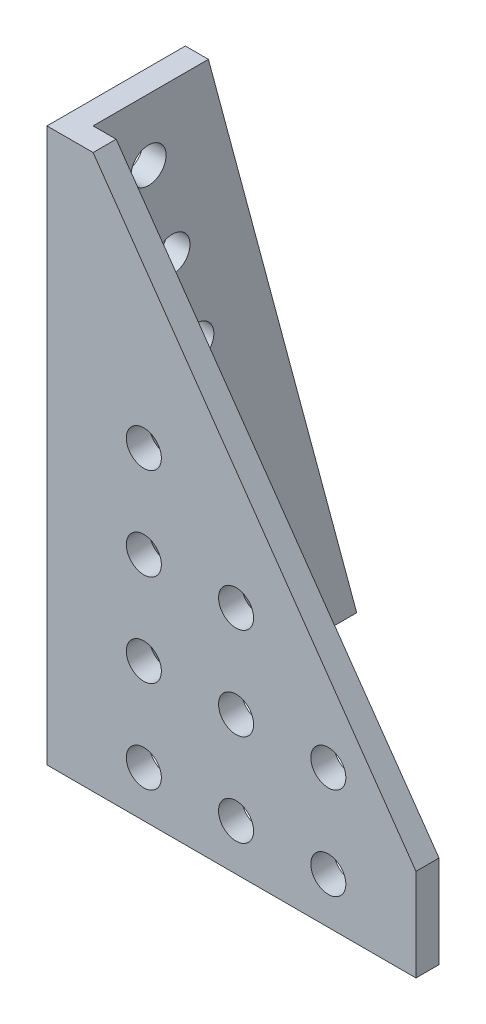
ISO-10303-21;
HEADER;
FILE_DESCRIPTION(('STEP AP214'),'2;1');
FILE_NAME('part.step','',(''),(''),'','','');
FILE_SCHEMA(('AUTOMOTIVE_DESIGN { 1 0 10303 214 1 1 1 1 }'));
ENDSEC;
DATA;
#1=APPLICATION_CONTEXT('core data for automotive mechanical design processes');
#2=APPLICATION_PROTOCOL_DEFINITION('international standard','automotive_design',2000,#1);
#3=PRODUCT_CONTEXT('',#1,'mechanical');
#4=PRODUCT('Part','Part','',(#3));
#5=PRODUCT_RELATED_PRODUCT_CATEGORY('part','',(#4));
#6=PRODUCT_DEFINITION_FORMATION('','',#4);
#7=PRODUCT_DEFINITION_CONTEXT('part definition',#1,'design');
#8=PRODUCT_DEFINITION('design','',#6,#7);
#9=PRODUCT_DEFINITION_SHAPE('','',#8);
#10=(LENGTH_UNIT() NAMED_UNIT(*) SI_UNIT(.MILLI.,.METRE.));
#11=(NAMED_UNIT(*) PLANE_ANGLE_UNIT() SI_UNIT($,.RADIAN.));
#12=(NAMED_UNIT(*) SI_UNIT($,.STERADIAN.) SOLID_ANGLE_UNIT());
#13=UNCERTAINTY_MEASURE_WITH_UNIT(LENGTH_MEASURE(1.E-05),#10,'distance_accuracy_value','');
#14=(GEOMETRIC_REPRESENTATION_CONTEXT(3) GLOBAL_UNCERTAINTY_ASSIGNED_CONTEXT((#13)) GLOBAL_UNIT_ASSIGNED_CONTEXT((#10,
#11,#12)) REPRESENTATION_CONTEXT('',''));
#15=CARTESIAN_POINT('',(0.,0.,0.));
#16=DIRECTION('',(0.,0.,1.));
#17=DIRECTION('',(1.,0.,0.));
#18=AXIS2_PLACEMENT_3D('',#15,#16,#17);
#19=CARTESIAN_POINT('',(0.,76.2,0.));
#20=DIRECTION('',(0.,0.,-1.));
#21=DIRECTION('',(-1.,0.,0.));
#22=AXIS2_PLACEMENT_3D('',#19,#20,#21);
#23=PLANE('',#22);
#24=CARTESIAN_POINT('',(13.335,44.45,0.));
#25=DIRECTION('',(0.,0.,-1.));
#26=DIRECTION('',(-1.,0.,0.));
#27=AXIS2_PLACEMENT_3D('',#24,#25,#26);
#28=CIRCLE('',#27,2.413);
#29=CARTESIAN_POINT('',(10.922,44.45,0.));
#30=VERTEX_POINT('',#29);
#31=EDGE_CURVE('E250',#30,#30,#28,.T.);
#32=ORIENTED_EDGE('',*,*,#31,.T.);
#33=EDGE_LOOP('',(#32));
#34=FACE_BOUND('',#33,.T.);
#35=CARTESIAN_POINT('',(13.335,31.75,0.));
#36=DIRECTION('',(0.,0.,-1.));
#37=DIRECTION('',(-1.,0.,0.));
#38=AXIS2_PLACEMENT_3D('',#35,#36,#37);
#39=CIRCLE('',#38,2.413);
#40=CARTESIAN_POINT('',(10.922,31.75,0.));
#41=VERTEX_POINT('',#40);
#42=EDGE_CURVE('E256',#41,#41,#39,.T.);
#43=ORIENTED_EDGE('',*,*,#42,.T.);
#44=EDGE_LOOP('',(#43));
#45=FACE_BOUND('',#44,.T.);
#46=CARTESIAN_POINT('',(13.335,19.05,0.));
#47=DIRECTION('',(0.,0.,-1.));
#48=DIRECTION('',(-1.,0.,0.));
#49=AXIS2_PLACEMENT_3D('',#46,#47,#48);
#50=CIRCLE('',#49,2.413);
#51=CARTESIAN_POINT('',(10.922,19.05,0.));
#52=VERTEX_POINT('',#51);
#53=EDGE_CURVE('E262',#52,#52,#50,.T.);
#54=ORIENTED_EDGE('',*,*,#53,.T.);
#55=EDGE_LOOP('',(#54));
#56=FACE_BOUND('',#55,.T.);
#57=CARTESIAN_POINT('',(13.335,6.35,0.));
#58=DIRECTION('',(0.,0.,-1.));
#59=DIRECTION('',(-1.,0.,0.));
#60=AXIS2_PLACEMENT_3D('',#57,#58,#59);
#61=CIRCLE('',#60,2.413);
#62=CARTESIAN_POINT('',(10.922,6.35,0.));
#63=VERTEX_POINT('',#62);
#64=EDGE_CURVE('E268',#63,#63,#61,.T.);
#65=ORIENTED_EDGE('',*,*,#64,.T.);
#66=EDGE_LOOP('',(#65));
#67=FACE_BOUND('',#66,.T.);
#68=CARTESIAN_POINT('',(38.735,19.05,0.));
#69=DIRECTION('',(0.,0.,-1.));
#70=DIRECTION('',(-1.,0.,0.));
#71=AXIS2_PLACEMENT_3D('',#68,#69,#70);
#72=CIRCLE('',#71,2.413);
#73=CARTESIAN_POINT('',(36.322,19.05,0.));
#74=VERTEX_POINT('',#73);
#75=EDGE_CURVE('E244',#74,#74,#72,.T.);
#76=ORIENTED_EDGE('',*,*,#75,.T.);
#77=EDGE_LOOP('',(#76));
#78=FACE_BOUND('',#77,.T.);
#79=CARTESIAN_POINT('',(26.035,31.75,0.));
#80=DIRECTION('',(0.,0.,-1.));
#81=DIRECTION('',(-1.,0.,0.));
#82=AXIS2_PLACEMENT_3D('',#79,#80,#81);
#83=CIRCLE('',#82,2.413);
#84=CARTESIAN_POINT('',(23.622,31.75,0.));
#85=VERTEX_POINT('',#84);
#86=EDGE_CURVE('E276',#85,#85,#83,.T.);
#87=ORIENTED_EDGE('',*,*,#86,.T.);
#88=EDGE_LOOP('',(#87));
#89=FACE_BOUND('',#88,.T.);
#90=CARTESIAN_POINT('',(26.035,19.05,0.));
#91=DIRECTION('',(0.,0.,-1.));
#92=DIRECTION('',(-1.,0.,0.));
#93=AXIS2_PLACEMENT_3D('',#90,#91,#92);
#94=CIRCLE('',#93,2.413);
#95=CARTESIAN_POINT('',(23.622,19.05,0.));
#96=VERTEX_POINT('',#95);
#97=EDGE_CURVE('E275',#96,#96,#94,.T.);
#98=ORIENTED_EDGE('',*,*,#97,.T.);
#99=EDGE_LOOP('',(#98));
#100=FACE_BOUND('',#99,.T.);
#101=CARTESIAN_POINT('',(26.035,6.35,0.));
#102=DIRECTION('',(0.,0.,-1.));
#103=DIRECTION('',(-1.,0.,0.));
#104=AXIS2_PLACEMENT_3D('',#101,#102,#103);
#105=CIRCLE('',#104,2.413);
#106=CARTESIAN_POINT('',(23.622,6.35,0.));
#107=VERTEX_POINT('',#106);
#108=EDGE_CURVE('E286',#107,#107,#105,.T.);
#109=ORIENTED_EDGE('',*,*,#108,.T.);
#110=EDGE_LOOP('',(#109));
#111=FACE_BOUND('',#110,.T.);
#112=CARTESIAN_POINT('',(38.735,6.35,0.));
#113=DIRECTION('',(0.,0.,-1.));
#114=DIRECTION('',(-1.,0.,0.));
#115=AXIS2_PLACEMENT_3D('',#112,#113,#114);
#116=CIRCLE('',#115,2.413);
#117=CARTESIAN_POINT('',(36.322,6.35,0.));
#118=VERTEX_POINT('',#117);
#119=EDGE_CURVE('E179',#118,#118,#116,.T.);
#120=ORIENTED_EDGE('',*,*,#119,.T.);
#121=EDGE_LOOP('',(#120));
#122=FACE_BOUND('',#121,.T.);
#123=DIRECTION('',(0.57357643635105,-0.819152044288989,0.));
#124=VECTOR('',#123,1.);
#125=CARTESIAN_POINT('',(40.0632028070022,28.0525566102876,0.));
#126=LINE('',#125,#124);
#127=CARTESIAN_POINT('',(6.35,76.2,0.));
#128=VERTEX_POINT('',#127);
#129=CARTESIAN_POINT('',(50.8,12.7188211003137,0.));
#130=VERTEX_POINT('',#129);
#131=EDGE_CURVE('E226',#128,#130,#126,.T.);
#132=ORIENTED_EDGE('',*,*,#131,.F.);
#133=DIRECTION('',(1.,0.,0.));
#134=VECTOR('',#133,1.);
#135=CARTESIAN_POINT('',(0.,76.2,0.));
#136=LINE('',#135,#134);
#137=CARTESIAN_POINT('',(0.,76.2,0.));
#138=VERTEX_POINT('',#137);
#139=EDGE_CURVE('E183',#138,#128,#136,.T.);
#140=ORIENTED_EDGE('',*,*,#139,.F.);
#141=DIRECTION('',(0.,-1.,0.));
#142=VECTOR('',#141,1.);
#143=CARTESIAN_POINT('',(0.,76.2,0.));
#144=LINE('',#143,#142);
#145=CARTESIAN_POINT('',(0.,0.,0.));
#146=VERTEX_POINT('',#145);
#147=EDGE_CURVE('E115',#138,#146,#144,.T.);
#148=ORIENTED_EDGE('',*,*,#147,.T.);
#149=DIRECTION('',(1.,0.,0.));
#150=VECTOR('',#149,1.);
#151=CARTESIAN_POINT('',(0.,0.,0.));
#152=LINE('',#151,#150);
#153=CARTESIAN_POINT('',(50.8,0.,0.));
#154=VERTEX_POINT('',#153);
#155=EDGE_CURVE('E200',#146,#154,#152,.T.);
#156=ORIENTED_EDGE('',*,*,#155,.T.);
#157=DIRECTION('',(0.,-1.,0.));
#158=VECTOR('',#157,1.);
#159=CARTESIAN_POINT('',(50.8,76.2,0.));
#160=LINE('',#159,#158);
#161=EDGE_CURVE('E212',#130,#154,#160,.T.);
#162=ORIENTED_EDGE('',*,*,#161,.F.);
#163=EDGE_LOOP('',(#132,#140,#148,#156,#162));
#164=FACE_BOUND('',#163,.T.);
#165=ADVANCED_FACE('F107',(#34,#45,#56,#67,#78,#89,#100,#111,#122,#164),#23,.F.);
#166=CARTESIAN_POINT('',(50.8,76.2,-3.175));
#167=DIRECTION('',(-1.,0.,0.));
#168=DIRECTION('',(0.,0.,1.));
#169=AXIS2_PLACEMENT_3D('',#166,#167,#168);
#170=PLANE('',#169);
#171=DIRECTION('',(0.,0.,-1.));
#172=VECTOR('',#171,1.);
#173=CARTESIAN_POINT('',(50.8,12.7188211003137,0.));
#174=LINE('',#173,#172);
#175=CARTESIAN_POINT('',(50.8,12.7188211003137,-3.175));
#176=VERTEX_POINT('',#175);
#177=EDGE_CURVE('E201',#130,#176,#174,.T.);
#178=ORIENTED_EDGE('',*,*,#177,.F.);
#179=ORIENTED_EDGE('',*,*,#161,.T.);
#180=DIRECTION('',(0.,0.,-1.));
#181=VECTOR('',#180,1.);
#182=CARTESIAN_POINT('',(50.8,0.,-3.175));
#183=LINE('',#182,#181);
#184=CARTESIAN_POINT('',(50.8,0.,-3.175));
#185=VERTEX_POINT('',#184);
#186=EDGE_CURVE('E204',#154,#185,#183,.T.);
#187=ORIENTED_EDGE('',*,*,#186,.T.);
#188=DIRECTION('',(0.,-1.,0.));
#189=VECTOR('',#188,1.);
#190=CARTESIAN_POINT('',(50.8,76.2,-3.175));
#191=LINE('',#190,#189);
#192=EDGE_CURVE('E210',#176,#185,#191,.T.);
#193=ORIENTED_EDGE('',*,*,#192,.F.);
#194=EDGE_LOOP('',(#178,#179,#187,#193));
#195=FACE_BOUND('',#194,.T.);
#196=ADVANCED_FACE('F225',(#195),#170,.F.);
#197=CARTESIAN_POINT('',(3.175,76.2,-3.175));
#198=DIRECTION('',(0.,0.,1.));
#199=DIRECTION('',(1.,0.,0.));
#200=AXIS2_PLACEMENT_3D('',#197,#198,#199);
#201=PLANE('',#200);
#202=CARTESIAN_POINT('',(13.335,44.45,-3.175));
#203=DIRECTION('',(0.,0.,-1.));
#204=DIRECTION('',(-1.,0.,0.));
#205=AXIS2_PLACEMENT_3D('',#202,#203,#204);
#206=CIRCLE('',#205,2.413);
#207=CARTESIAN_POINT('',(10.922,44.45,-3.175));
#208=VERTEX_POINT('',#207);
#209=EDGE_CURVE('E247',#208,#208,#206,.T.);
#210=ORIENTED_EDGE('',*,*,#209,.F.);
#211=EDGE_LOOP('',(#210));
#212=FACE_BOUND('',#211,.T.);
#213=CARTESIAN_POINT('',(13.335,31.75,-3.175));
#214=DIRECTION('',(0.,0.,-1.));
#215=DIRECTION('',(-1.,0.,0.));
#216=AXIS2_PLACEMENT_3D('',#213,#214,#215);
#217=CIRCLE('',#216,2.413);
#218=CARTESIAN_POINT('',(10.922,31.75,-3.175));
#219=VERTEX_POINT('',#218);
#220=EDGE_CURVE('E253',#219,#219,#217,.T.);
#221=ORIENTED_EDGE('',*,*,#220,.F.);
#222=EDGE_LOOP('',(#221));
#223=FACE_BOUND('',#222,.T.);
#224=CARTESIAN_POINT('',(13.335,19.05,-3.175));
#225=DIRECTION('',(0.,0.,-1.));
#226=DIRECTION('',(-1.,0.,0.));
#227=AXIS2_PLACEMENT_3D('',#224,#225,#226);
#228=CIRCLE('',#227,2.413);
#229=CARTESIAN_POINT('',(10.922,19.05,-3.175));
#230=VERTEX_POINT('',#229);
#231=EDGE_CURVE('E259',#230,#230,#228,.T.);
#232=ORIENTED_EDGE('',*,*,#231,.F.);
#233=EDGE_LOOP('',(#232));
#234=FACE_BOUND('',#233,.T.);
#235=CARTESIAN_POINT('',(13.335,6.35,-3.175));
#236=DIRECTION('',(0.,0.,-1.));
#237=DIRECTION('',(-1.,0.,0.));
#238=AXIS2_PLACEMENT_3D('',#235,#236,#237);
#239=CIRCLE('',#238,2.413);
#240=CARTESIAN_POINT('',(10.922,6.35,-3.175));
#241=VERTEX_POINT('',#240);
#242=EDGE_CURVE('E265',#241,#241,#239,.T.);
#243=ORIENTED_EDGE('',*,*,#242,.F.);
#244=EDGE_LOOP('',(#243));
#245=FACE_BOUND('',#244,.T.);
#246=CARTESIAN_POINT('',(38.735,19.05,-3.175));
#247=DIRECTION('',(0.,0.,-1.));
#248=DIRECTION('',(-1.,0.,0.));
#249=AXIS2_PLACEMENT_3D('',#246,#247,#248);
#250=CIRCLE('',#249,2.413);
#251=CARTESIAN_POINT('',(36.322,19.05,-3.175));
#252=VERTEX_POINT('',#251);
#253=EDGE_CURVE('E279',#252,#252,#250,.T.);
#254=ORIENTED_EDGE('',*,*,#253,.F.);
#255=EDGE_LOOP('',(#254));
#256=FACE_BOUND('',#255,.T.);
#257=CARTESIAN_POINT('',(26.035,31.75,-3.175));
#258=DIRECTION('',(0.,0.,-1.));
#259=DIRECTION('',(-1.,0.,0.));
#260=AXIS2_PLACEMENT_3D('',#257,#258,#259);
#261=CIRCLE('',#260,2.413);
#262=CARTESIAN_POINT('',(23.622,31.75,-3.175));
#263=VERTEX_POINT('',#262);
#264=EDGE_CURVE('E272',#263,#263,#261,.T.);
#265=ORIENTED_EDGE('',*,*,#264,.F.);
#266=EDGE_LOOP('',(#265));
#267=FACE_BOUND('',#266,.T.);
#268=CARTESIAN_POINT('',(26.035,19.05,-3.175));
#269=DIRECTION('',(0.,0.,-1.));
#270=DIRECTION('',(-1.,0.,0.));
#271=AXIS2_PLACEMENT_3D('',#268,#269,#270);
#272=CIRCLE('',#271,2.413);
#273=CARTESIAN_POINT('',(23.622,19.05,-3.175));
#274=VERTEX_POINT('',#273);
#275=EDGE_CURVE('E289',#274,#274,#272,.T.);
#276=ORIENTED_EDGE('',*,*,#275,.F.);
#277=EDGE_LOOP('',(#276));
#278=FACE_BOUND('',#277,.T.);
#279=CARTESIAN_POINT('',(26.035,6.35,-3.175));
#280=DIRECTION('',(0.,0.,-1.));
#281=DIRECTION('',(-1.,0.,0.));
#282=AXIS2_PLACEMENT_3D('',#279,#280,#281);
#283=CIRCLE('',#282,2.413);
#284=CARTESIAN_POINT('',(23.622,6.35,-3.175));
#285=VERTEX_POINT('',#284);
#286=EDGE_CURVE('E271',#285,#285,#283,.T.);
#287=ORIENTED_EDGE('',*,*,#286,.F.);
#288=EDGE_LOOP('',(#287));
#289=FACE_BOUND('',#288,.T.);
#290=CARTESIAN_POINT('',(38.735,6.35,-3.175));
#291=DIRECTION('',(0.,0.,-1.));
#292=DIRECTION('',(-1.,0.,0.));
#293=AXIS2_PLACEMENT_3D('',#290,#291,#292);
#294=CIRCLE('',#293,2.413);
#295=CARTESIAN_POINT('',(36.322,6.35,-3.175));
#296=VERTEX_POINT('',#295);
#297=EDGE_CURVE('E241',#296,#296,#294,.T.);
#298=ORIENTED_EDGE('',*,*,#297,.F.);
#299=EDGE_LOOP('',(#298));
#300=FACE_BOUND('',#299,.T.);
#301=DIRECTION('',(0.57357643635105,-0.819152044288989,0.));
#302=VECTOR('',#301,1.);
#303=CARTESIAN_POINT('',(40.0632028070022,28.0525566102876,-3.175));
#304=LINE('',#303,#302);
#305=CARTESIAN_POINT('',(6.35,76.2,-3.175));
#306=VERTEX_POINT('',#305);
#307=EDGE_CURVE('E129',#306,#176,#304,.T.);
#308=ORIENTED_EDGE('',*,*,#307,.T.);
#309=ORIENTED_EDGE('',*,*,#192,.T.);
#310=DIRECTION('',(-1.,0.,0.));
#311=VECTOR('',#310,1.);
#312=CARTESIAN_POINT('',(3.175,0.,-3.175));
#313=LINE('',#312,#311);
#314=CARTESIAN_POINT('',(3.175,0.,-3.175));
#315=VERTEX_POINT('',#314);
#316=EDGE_CURVE('E189',#185,#315,#313,.T.);
#317=ORIENTED_EDGE('',*,*,#316,.T.);
#318=DIRECTION('',(0.,-1.,0.));
#319=VECTOR('',#318,1.);
#320=CARTESIAN_POINT('',(3.175,76.2,-3.175));
#321=LINE('',#320,#319);
#322=CARTESIAN_POINT('',(3.175,76.2,-3.175));
#323=VERTEX_POINT('',#322);
#324=EDGE_CURVE('E197',#323,#315,#321,.T.);
#325=ORIENTED_EDGE('',*,*,#324,.F.);
#326=DIRECTION('',(-1.,0.,0.));
#327=VECTOR('',#326,1.);
#328=CARTESIAN_POINT('',(3.175,76.2,-3.175));
#329=LINE('',#328,#327);
#330=EDGE_CURVE('E186',#306,#323,#329,.T.);
#331=ORIENTED_EDGE('',*,*,#330,.F.);
#332=EDGE_LOOP('',(#308,#309,#317,#325,#331));
#333=FACE_BOUND('',#332,.T.);
#334=ADVANCED_FACE('F231',(#212,#223,#234,#245,#256,#267,#278,#289,#300,#333),#201,.F.);
#335=CARTESIAN_POINT('',(0.,76.2,0.));
#336=DIRECTION('',(0.,-1.,0.));
#337=DIRECTION('',(0.,0.,-1.));
#338=AXIS2_PLACEMENT_3D('',#335,#336,#337);
#339=PLANE('',#338);
#340=DIRECTION('',(0.,0.,-1.));
#341=VECTOR('',#340,1.);
#342=CARTESIAN_POINT('',(3.175,76.2,-50.8));
#343=LINE('',#342,#341);
#344=CARTESIAN_POINT('',(3.175,76.2,-19.05));
#345=VERTEX_POINT('',#344);
#346=EDGE_CURVE('E178',#323,#345,#343,.T.);
#347=ORIENTED_EDGE('',*,*,#346,.T.);
#348=DIRECTION('',(1.,0.,0.));
#349=VECTOR('',#348,1.);
#350=CARTESIAN_POINT('',(0.,76.2,-19.05));
#351=LINE('',#350,#349);
#352=CARTESIAN_POINT('',(0.,76.2,-19.05));
#353=VERTEX_POINT('',#352);
#354=EDGE_CURVE('E166',#353,#345,#351,.T.);
#355=ORIENTED_EDGE('',*,*,#354,.F.);
#356=DIRECTION('',(0.,0.,1.));
#357=VECTOR('',#356,1.);
#358=CARTESIAN_POINT('',(0.,76.2,-50.8));
#359=LINE('',#358,#357);
#360=EDGE_CURVE('E175',#353,#138,#359,.T.);
#361=ORIENTED_EDGE('',*,*,#360,.T.);
#362=ORIENTED_EDGE('',*,*,#139,.T.);
#363=DIRECTION('',(0.,0.,-1.));
#364=VECTOR('',#363,1.);
#365=CARTESIAN_POINT('',(6.35,76.2,0.));
#366=LINE('',#365,#364);
#367=EDGE_CURVE('E192',#128,#306,#366,.T.);
#368=ORIENTED_EDGE('',*,*,#367,.T.);
#369=ORIENTED_EDGE('',*,*,#330,.T.);
#370=EDGE_LOOP('',(#347,#355,#361,#362,#368,#369));
#371=FACE_BOUND('',#370,.T.);
#372=ADVANCED_FACE('F173',(#371),#339,.F.);
#373=CARTESIAN_POINT('',(0.,76.2,-50.8));
#374=DIRECTION('',(1.,0.,0.));
#375=DIRECTION('',(0.,0.,-1.));
#376=AXIS2_PLACEMENT_3D('',#373,#374,#375);
#377=PLANE('',#376);
#378=CARTESIAN_POINT('',(0.,67.6862899693559,-10.8128357343374));
#379=DIRECTION('',(1.,0.,0.));
#380=DIRECTION('',(0.,0.,-1.));
#381=AXIS2_PLACEMENT_3D('',#378,#379,#380);
#382=CIRCLE('',#381,2.413);
#383=CARTESIAN_POINT('',(0.,67.6862899693559,-13.2258357343374));
#384=VERTEX_POINT('',#383);
#385=EDGE_CURVE('E331',#384,#384,#382,.T.);
#386=ORIENTED_EDGE('',*,*,#385,.T.);
#387=EDGE_LOOP('',(#386));
#388=FACE_BOUND('',#387,.T.);
#389=CARTESIAN_POINT('',(0.,55.4190319754847,-14.0998376071394));
#390=DIRECTION('',(1.,0.,0.));
#391=DIRECTION('',(0.,0.,-1.));
#392=AXIS2_PLACEMENT_3D('',#389,#390,#391);
#393=CIRCLE('',#392,2.413);
#394=CARTESIAN_POINT('',(0.,55.4190319754847,-16.5128376071394));
#395=VERTEX_POINT('',#394);
#396=EDGE_CURVE('E335',#395,#395,#393,.T.);
#397=ORIENTED_EDGE('',*,*,#396,.T.);
#398=EDGE_LOOP('',(#397));
#399=FACE_BOUND('',#398,.T.);
#400=CARTESIAN_POINT('',(0.,43.1517739816135,-17.3868394799413));
#401=DIRECTION('',(1.,0.,0.));
#402=DIRECTION('',(0.,0.,-1.));
#403=AXIS2_PLACEMENT_3D('',#400,#401,#402);
#404=CIRCLE('',#403,2.413);
#405=CARTESIAN_POINT('',(0.,43.1517739816135,-19.7998394799413));
#406=VERTEX_POINT('',#405);
#407=EDGE_CURVE('E339',#406,#406,#404,.T.);
#408=ORIENTED_EDGE('',*,*,#407,.T.);
#409=EDGE_LOOP('',(#408));
#410=FACE_BOUND('',#409,.T.);
#411=CARTESIAN_POINT('',(0.,30.8845159877423,-20.6738413527433));
#412=DIRECTION('',(1.,0.,0.));
#413=DIRECTION('',(0.,0.,-1.));
#414=AXIS2_PLACEMENT_3D('',#411,#412,#413);
#415=CIRCLE('',#414,2.413);
#416=CARTESIAN_POINT('',(0.,30.8845159877423,-23.0868413527433));
#417=VERTEX_POINT('',#416);
#418=EDGE_CURVE('E343',#417,#417,#415,.T.);
#419=ORIENTED_EDGE('',*,*,#418,.T.);
#420=EDGE_LOOP('',(#419));
#421=FACE_BOUND('',#420,.T.);
#422=CARTESIAN_POINT('',(0.,18.6172579938712,-23.9608432255453));
#423=DIRECTION('',(1.,0.,0.));
#424=DIRECTION('',(0.,0.,-1.));
#425=AXIS2_PLACEMENT_3D('',#422,#423,#424);
#426=CIRCLE('',#425,2.413);
#427=CARTESIAN_POINT('',(0.,18.6172579938712,-26.3738432255453));
#428=VERTEX_POINT('',#427);
#429=EDGE_CURVE('E347',#428,#428,#426,.T.);
#430=ORIENTED_EDGE('',*,*,#429,.T.);
#431=EDGE_LOOP('',(#430));
#432=FACE_BOUND('',#431,.T.);
#433=CARTESIAN_POINT('',(0.,6.35,-27.2478450983473));
#434=DIRECTION('',(1.,0.,0.));
#435=DIRECTION('',(0.,0.,-1.));
#436=AXIS2_PLACEMENT_3D('',#433,#434,#435);
#437=CIRCLE('',#436,2.413);
#438=CARTESIAN_POINT('',(0.,6.35,-29.6608450983473));
#439=VERTEX_POINT('',#438);
#440=EDGE_CURVE('E234',#439,#439,#437,.T.);
#441=ORIENTED_EDGE('',*,*,#440,.T.);
#442=EDGE_LOOP('',(#441));
#443=FACE_BOUND('',#442,.T.);
#444=ORIENTED_EDGE('',*,*,#360,.F.);
#445=DIRECTION('',(0.,-0.965925826289069,-0.258819045102518));
#446=VECTOR('',#445,1.);
#447=CARTESIAN_POINT('',(0.,-42.2926131403132,-50.8));
#448=LINE('',#447,#446);
#449=CARTESIAN_POINT('',(0.,0.,-39.4677284632513));
#450=VERTEX_POINT('',#449);
#451=EDGE_CURVE('E163',#353,#450,#448,.T.);
#452=ORIENTED_EDGE('',*,*,#451,.T.);
#453=DIRECTION('',(0.,0.,1.));
#454=VECTOR('',#453,1.);
#455=CARTESIAN_POINT('',(0.,0.,-50.8));
#456=LINE('',#455,#454);
#457=EDGE_CURVE('E198',#450,#146,#456,.T.);
#458=ORIENTED_EDGE('',*,*,#457,.T.);
#459=ORIENTED_EDGE('',*,*,#147,.F.);
#460=EDGE_LOOP('',(#444,#452,#458,#459));
#461=FACE_BOUND('',#460,.T.);
#462=ADVANCED_FACE('F109',(#388,#399,#410,#421,#432,#443,#461),#377,.F.);
#463=CARTESIAN_POINT('',(3.175,76.2,-50.8));
#464=DIRECTION('',(-1.,0.,0.));
#465=DIRECTION('',(0.,0.,1.));
#466=AXIS2_PLACEMENT_3D('',#463,#464,#465);
#467=PLANE('',#466);
#468=CARTESIAN_POINT('',(3.175,67.6862899693559,-10.8128357343374));
#469=DIRECTION('',(1.,0.,0.));
#470=DIRECTION('',(0.,0.,-1.));
#471=AXIS2_PLACEMENT_3D('',#468,#469,#470);
#472=CIRCLE('',#471,2.413);
#473=CARTESIAN_POINT('',(3.175,67.6862899693559,-13.2258357343374));
#474=VERTEX_POINT('',#473);
#475=EDGE_CURVE('E376',#474,#474,#472,.T.);
#476=ORIENTED_EDGE('',*,*,#475,.F.);
#477=EDGE_LOOP('',(#476));
#478=FACE_BOUND('',#477,.T.);
#479=CARTESIAN_POINT('',(3.175,55.4190319754847,-14.0998376071394));
#480=DIRECTION('',(1.,0.,0.));
#481=DIRECTION('',(0.,0.,-1.));
#482=AXIS2_PLACEMENT_3D('',#479,#480,#481);
#483=CIRCLE('',#482,2.413);
#484=CARTESIAN_POINT('',(3.175,55.4190319754847,-16.5128376071394));
#485=VERTEX_POINT('',#484);
#486=EDGE_CURVE('E373',#485,#485,#483,.T.);
#487=ORIENTED_EDGE('',*,*,#486,.F.);
#488=EDGE_LOOP('',(#487));
#489=FACE_BOUND('',#488,.T.);
#490=CARTESIAN_POINT('',(3.175,43.1517739816135,-17.3868394799413));
#491=DIRECTION('',(1.,0.,0.));
#492=DIRECTION('',(0.,0.,-1.));
#493=AXIS2_PLACEMENT_3D('',#490,#491,#492);
#494=CIRCLE('',#493,2.413);
#495=CARTESIAN_POINT('',(3.175,43.1517739816135,-19.7998394799413));
#496=VERTEX_POINT('',#495);
#497=EDGE_CURVE('E369',#496,#496,#494,.T.);
#498=ORIENTED_EDGE('',*,*,#497,.F.);
#499=EDGE_LOOP('',(#498));
#500=FACE_BOUND('',#499,.T.);
#501=CARTESIAN_POINT('',(3.175,30.8845159877423,-20.6738413527433));
#502=DIRECTION('',(1.,0.,0.));
#503=DIRECTION('',(0.,0.,-1.));
#504=AXIS2_PLACEMENT_3D('',#501,#502,#503);
#505=CIRCLE('',#504,2.413);
#506=CARTESIAN_POINT('',(3.175,30.8845159877423,-23.0868413527433));
#507=VERTEX_POINT('',#506);
#508=EDGE_CURVE('E365',#507,#507,#505,.T.);
#509=ORIENTED_EDGE('',*,*,#508,.F.);
#510=EDGE_LOOP('',(#509));
#511=FACE_BOUND('',#510,.T.);
#512=CARTESIAN_POINT('',(3.175,18.6172579938712,-23.9608432255453));
#513=DIRECTION('',(1.,0.,0.));
#514=DIRECTION('',(0.,0.,-1.));
#515=AXIS2_PLACEMENT_3D('',#512,#513,#514);
#516=CIRCLE('',#515,2.413);
#517=CARTESIAN_POINT('',(3.175,18.6172579938712,-26.3738432255453));
#518=VERTEX_POINT('',#517);
#519=EDGE_CURVE('E359',#518,#518,#516,.T.);
#520=ORIENTED_EDGE('',*,*,#519,.F.);
#521=EDGE_LOOP('',(#520));
#522=FACE_BOUND('',#521,.T.);
#523=CARTESIAN_POINT('',(3.175,6.35,-27.2478450983473));
#524=DIRECTION('',(1.,0.,0.));
#525=DIRECTION('',(0.,0.,-1.));
#526=AXIS2_PLACEMENT_3D('',#523,#524,#525);
#527=CIRCLE('',#526,2.413);
#528=CARTESIAN_POINT('',(3.175,6.35,-29.6608450983473));
#529=VERTEX_POINT('',#528);
#530=EDGE_CURVE('E237',#529,#529,#527,.T.);
#531=ORIENTED_EDGE('',*,*,#530,.F.);
#532=EDGE_LOOP('',(#531));
#533=FACE_BOUND('',#532,.T.);
#534=DIRECTION('',(0.,0.,-1.));
#535=VECTOR('',#534,1.);
#536=CARTESIAN_POINT('',(3.175,0.,-50.8));
#537=LINE('',#536,#535);
#538=CARTESIAN_POINT('',(3.175,0.,-39.4677284632513));
#539=VERTEX_POINT('',#538);
#540=EDGE_CURVE('E184',#315,#539,#537,.T.);
#541=ORIENTED_EDGE('',*,*,#540,.T.);
#542=DIRECTION('',(0.,-0.965925826289069,-0.258819045102518));
#543=VECTOR('',#542,1.);
#544=CARTESIAN_POINT('',(3.175,-42.2926131403132,-50.8));
#545=LINE('',#544,#543);
#546=EDGE_CURVE('E121',#345,#539,#545,.T.);
#547=ORIENTED_EDGE('',*,*,#546,.F.);
#548=ORIENTED_EDGE('',*,*,#346,.F.);
#549=ORIENTED_EDGE('',*,*,#324,.T.);
#550=EDGE_LOOP('',(#541,#547,#548,#549));
#551=FACE_BOUND('',#550,.T.);
#552=ADVANCED_FACE('F233',(#478,#489,#500,#511,#522,#533,#551),#467,.F.);
#553=CARTESIAN_POINT('',(0.,0.,0.));
#554=DIRECTION('',(0.,-1.,0.));
#555=DIRECTION('',(0.,0.,-1.));
#556=AXIS2_PLACEMENT_3D('',#553,#554,#555);
#557=PLANE('',#556);
#558=DIRECTION('',(-1.,0.,0.));
#559=VECTOR('',#558,1.);
#560=CARTESIAN_POINT('',(0.,0.,-39.4677284632513));
#561=LINE('',#560,#559);
#562=EDGE_CURVE('E12',#539,#450,#561,.T.);
#563=ORIENTED_EDGE('',*,*,#562,.F.);
#564=ORIENTED_EDGE('',*,*,#540,.F.);
#565=ORIENTED_EDGE('',*,*,#316,.F.);
#566=ORIENTED_EDGE('',*,*,#186,.F.);
#567=ORIENTED_EDGE('',*,*,#155,.F.);
#568=ORIENTED_EDGE('',*,*,#457,.F.);
#569=EDGE_LOOP('',(#563,#564,#565,#566,#567,#568));
#570=FACE_BOUND('',#569,.T.);
#571=ADVANCED_FACE('F219',(#570),#557,.T.);
#572=CARTESIAN_POINT('',(40.0632028070022,28.0525566102876,0.));
#573=DIRECTION('',(0.819152044288989,0.57357643635105,0.));
#574=DIRECTION('',(-0.57357643635105,0.819152044288989,0.));
#575=AXIS2_PLACEMENT_3D('',#572,#573,#574);
#576=PLANE('',#575);
#577=ORIENTED_EDGE('',*,*,#307,.F.);
#578=ORIENTED_EDGE('',*,*,#367,.F.);
#579=ORIENTED_EDGE('',*,*,#131,.T.);
#580=ORIENTED_EDGE('',*,*,#177,.T.);
#581=EDGE_LOOP('',(#577,#578,#579,#580));
#582=FACE_BOUND('',#581,.T.);
#583=ADVANCED_FACE('F294',(#582),#576,.T.);
#584=CARTESIAN_POINT('',(38.735,6.35,0.));
#585=DIRECTION('',(0.,0.,-1.));
#586=DIRECTION('',(-1.,0.,0.));
#587=AXIS2_PLACEMENT_3D('',#584,#585,#586);
#588=CYLINDRICAL_SURFACE('',#587,2.413);
#589=ORIENTED_EDGE('',*,*,#119,.F.);
#590=EDGE_LOOP('',(#589));
#591=FACE_BOUND('',#590,.T.);
#592=ORIENTED_EDGE('',*,*,#297,.T.);
#593=EDGE_LOOP('',(#592));
#594=FACE_BOUND('',#593,.T.);
#595=ADVANCED_FACE('F296',(#591,#594),#588,.F.);
#596=CARTESIAN_POINT('',(26.035,6.35,0.));
#597=DIRECTION('',(0.,0.,-1.));
#598=DIRECTION('',(-1.,0.,0.));
#599=AXIS2_PLACEMENT_3D('',#596,#597,#598);
#600=CYLINDRICAL_SURFACE('',#599,2.413);
#601=ORIENTED_EDGE('',*,*,#108,.F.);
#602=EDGE_LOOP('',(#601));
#603=FACE_BOUND('',#602,.T.);
#604=ORIENTED_EDGE('',*,*,#286,.T.);
#605=EDGE_LOOP('',(#604));
#606=FACE_BOUND('',#605,.T.);
#607=ADVANCED_FACE('F302',(#603,#606),#600,.F.);
#608=CARTESIAN_POINT('',(26.035,19.05,0.));
#609=DIRECTION('',(0.,0.,-1.));
#610=DIRECTION('',(-1.,0.,0.));
#611=AXIS2_PLACEMENT_3D('',#608,#609,#610);
#612=CYLINDRICAL_SURFACE('',#611,2.413);
#613=ORIENTED_EDGE('',*,*,#97,.F.);
#614=EDGE_LOOP('',(#613));
#615=FACE_BOUND('',#614,.T.);
#616=ORIENTED_EDGE('',*,*,#275,.T.);
#617=EDGE_LOOP('',(#616));
#618=FACE_BOUND('',#617,.T.);
#619=ADVANCED_FACE('F433',(#615,#618),#612,.F.);
#620=CARTESIAN_POINT('',(26.035,31.75,0.));
#621=DIRECTION('',(0.,0.,-1.));
#622=DIRECTION('',(-1.,0.,0.));
#623=AXIS2_PLACEMENT_3D('',#620,#621,#622);
#624=CYLINDRICAL_SURFACE('',#623,2.413);
#625=ORIENTED_EDGE('',*,*,#86,.F.);
#626=EDGE_LOOP('',(#625));
#627=FACE_BOUND('',#626,.T.);
#628=ORIENTED_EDGE('',*,*,#264,.T.);
#629=EDGE_LOOP('',(#628));
#630=FACE_BOUND('',#629,.T.);
#631=ADVANCED_FACE('F430',(#627,#630),#624,.F.);
#632=CARTESIAN_POINT('',(38.735,19.05,0.));
#633=DIRECTION('',(0.,0.,-1.));
#634=DIRECTION('',(-1.,0.,0.));
#635=AXIS2_PLACEMENT_3D('',#632,#633,#634);
#636=CYLINDRICAL_SURFACE('',#635,2.413);
#637=ORIENTED_EDGE('',*,*,#75,.F.);
#638=EDGE_LOOP('',(#637));
#639=FACE_BOUND('',#638,.T.);
#640=ORIENTED_EDGE('',*,*,#253,.T.);
#641=EDGE_LOOP('',(#640));
#642=FACE_BOUND('',#641,.T.);
#643=ADVANCED_FACE('F428',(#639,#642),#636,.F.);
#644=CARTESIAN_POINT('',(13.335,6.35,0.));
#645=DIRECTION('',(0.,0.,-1.));
#646=DIRECTION('',(-1.,0.,0.));
#647=AXIS2_PLACEMENT_3D('',#644,#645,#646);
#648=CYLINDRICAL_SURFACE('',#647,2.413);
#649=ORIENTED_EDGE('',*,*,#64,.F.);
#650=EDGE_LOOP('',(#649));
#651=FACE_BOUND('',#650,.T.);
#652=ORIENTED_EDGE('',*,*,#242,.T.);
#653=EDGE_LOOP('',(#652));
#654=FACE_BOUND('',#653,.T.);
#655=ADVANCED_FACE('F424',(#651,#654),#648,.F.);
#656=CARTESIAN_POINT('',(13.335,19.05,0.));
#657=DIRECTION('',(0.,0.,-1.));
#658=DIRECTION('',(-1.,0.,0.));
#659=AXIS2_PLACEMENT_3D('',#656,#657,#658);
#660=CYLINDRICAL_SURFACE('',#659,2.413);
#661=ORIENTED_EDGE('',*,*,#53,.F.);
#662=EDGE_LOOP('',(#661));
#663=FACE_BOUND('',#662,.T.);
#664=ORIENTED_EDGE('',*,*,#231,.T.);
#665=EDGE_LOOP('',(#664));
#666=FACE_BOUND('',#665,.T.);
#667=ADVANCED_FACE('F420',(#663,#666),#660,.F.);
#668=CARTESIAN_POINT('',(13.335,31.75,0.));
#669=DIRECTION('',(0.,0.,-1.));
#670=DIRECTION('',(-1.,0.,0.));
#671=AXIS2_PLACEMENT_3D('',#668,#669,#670);
#672=CYLINDRICAL_SURFACE('',#671,2.413);
#673=ORIENTED_EDGE('',*,*,#42,.F.);
#674=EDGE_LOOP('',(#673));
#675=FACE_BOUND('',#674,.T.);
#676=ORIENTED_EDGE('',*,*,#220,.T.);
#677=EDGE_LOOP('',(#676));
#678=FACE_BOUND('',#677,.T.);
#679=ADVANCED_FACE('F416',(#675,#678),#672,.F.);
#680=CARTESIAN_POINT('',(13.335,44.45,0.));
#681=DIRECTION('',(0.,0.,-1.));
#682=DIRECTION('',(-1.,0.,0.));
#683=AXIS2_PLACEMENT_3D('',#680,#681,#682);
#684=CYLINDRICAL_SURFACE('',#683,2.413);
#685=ORIENTED_EDGE('',*,*,#31,.F.);
#686=EDGE_LOOP('',(#685));
#687=FACE_BOUND('',#686,.T.);
#688=ORIENTED_EDGE('',*,*,#209,.T.);
#689=EDGE_LOOP('',(#688));
#690=FACE_BOUND('',#689,.T.);
#691=ADVANCED_FACE('F412',(#687,#690),#684,.F.);
#692=CARTESIAN_POINT('',(0.,-42.2926131403132,-50.8));
#693=DIRECTION('',(0.,-0.258819045102518,0.965925826289069));
#694=DIRECTION('',(0.,-0.965925826289069,-0.258819045102518));
#695=AXIS2_PLACEMENT_3D('',#692,#693,#694);
#696=PLANE('',#695);
#697=ORIENTED_EDGE('',*,*,#562,.T.);
#698=ORIENTED_EDGE('',*,*,#451,.F.);
#699=ORIENTED_EDGE('',*,*,#354,.T.);
#700=ORIENTED_EDGE('',*,*,#546,.T.);
#701=EDGE_LOOP('',(#697,#698,#699,#700));
#702=FACE_BOUND('',#701,.T.);
#703=ADVANCED_FACE('F165',(#702),#696,.F.);
#704=CARTESIAN_POINT('',(0.,6.35,-27.2478450983473));
#705=DIRECTION('',(1.,0.,0.));
#706=DIRECTION('',(0.,0.,-1.));
#707=AXIS2_PLACEMENT_3D('',#704,#705,#706);
#708=CYLINDRICAL_SURFACE('',#707,2.413);
#709=ORIENTED_EDGE('',*,*,#440,.F.);
#710=EDGE_LOOP('',(#709));
#711=FACE_BOUND('',#710,.T.);
#712=ORIENTED_EDGE('',*,*,#530,.T.);
#713=EDGE_LOOP('',(#712));
#714=FACE_BOUND('',#713,.T.);
#715=ADVANCED_FACE('F350',(#711,#714),#708,.F.);
#716=CARTESIAN_POINT('',(0.,18.6172579938712,-23.9608432255453));
#717=DIRECTION('',(1.,0.,0.));
#718=DIRECTION('',(0.,0.,-1.));
#719=AXIS2_PLACEMENT_3D('',#716,#717,#718);
#720=CYLINDRICAL_SURFACE('',#719,2.413);
#721=ORIENTED_EDGE('',*,*,#429,.F.);
#722=EDGE_LOOP('',(#721));
#723=FACE_BOUND('',#722,.T.);
#724=ORIENTED_EDGE('',*,*,#519,.T.);
#725=EDGE_LOOP('',(#724));
#726=FACE_BOUND('',#725,.T.);
#727=ADVANCED_FACE('F353',(#723,#726),#720,.F.);
#728=CARTESIAN_POINT('',(0.,30.8845159877423,-20.6738413527433));
#729=DIRECTION('',(1.,0.,0.));
#730=DIRECTION('',(0.,0.,-1.));
#731=AXIS2_PLACEMENT_3D('',#728,#729,#730);
#732=CYLINDRICAL_SURFACE('',#731,2.413);
#733=ORIENTED_EDGE('',*,*,#418,.F.);
#734=EDGE_LOOP('',(#733));
#735=FACE_BOUND('',#734,.T.);
#736=ORIENTED_EDGE('',*,*,#508,.T.);
#737=EDGE_LOOP('',(#736));
#738=FACE_BOUND('',#737,.T.);
#739=ADVANCED_FACE('F391',(#735,#738),#732,.F.);
#740=CARTESIAN_POINT('',(0.,43.1517739816135,-17.3868394799413));
#741=DIRECTION('',(1.,0.,0.));
#742=DIRECTION('',(0.,0.,-1.));
#743=AXIS2_PLACEMENT_3D('',#740,#741,#742);
#744=CYLINDRICAL_SURFACE('',#743,2.413);
#745=ORIENTED_EDGE('',*,*,#407,.F.);
#746=EDGE_LOOP('',(#745));
#747=FACE_BOUND('',#746,.T.);
#748=ORIENTED_EDGE('',*,*,#497,.T.);
#749=EDGE_LOOP('',(#748));
#750=FACE_BOUND('',#749,.T.);
#751=ADVANCED_FACE('F397',(#747,#750),#744,.F.);
#752=CARTESIAN_POINT('',(0.,55.4190319754847,-14.0998376071394));
#753=DIRECTION('',(1.,0.,0.));
#754=DIRECTION('',(0.,0.,-1.));
#755=AXIS2_PLACEMENT_3D('',#752,#753,#754);
#756=CYLINDRICAL_SURFACE('',#755,2.413);
#757=ORIENTED_EDGE('',*,*,#396,.F.);
#758=EDGE_LOOP('',(#757));
#759=FACE_BOUND('',#758,.T.);
#760=ORIENTED_EDGE('',*,*,#486,.T.);
#761=EDGE_LOOP('',(#760));
#762=FACE_BOUND('',#761,.T.);
#763=ADVANCED_FACE('F403',(#759,#762),#756,.F.);
#764=CARTESIAN_POINT('',(0.,67.6862899693559,-10.8128357343374));
#765=DIRECTION('',(1.,0.,0.));
#766=DIRECTION('',(0.,0.,-1.));
#767=AXIS2_PLACEMENT_3D('',#764,#765,#766);
#768=CYLINDRICAL_SURFACE('',#767,2.413);
#769=ORIENTED_EDGE('',*,*,#385,.F.);
#770=EDGE_LOOP('',(#769));
#771=FACE_BOUND('',#770,.T.);
#772=ORIENTED_EDGE('',*,*,#475,.T.);
#773=EDGE_LOOP('',(#772));
#774=FACE_BOUND('',#773,.T.);
#775=ADVANCED_FACE('F380',(#771,#774),#768,.F.);
#776=CLOSED_SHELL('',(#165,#196,#334,#372,#462,#552,#571,#583,#595,#607,#619,#631,#643,#655,
#667,#679,#691,#703,#715,#727,#739,#751,#763,#775));
#777=MANIFOLD_SOLID_BREP('B2',#776);
#778=ADVANCED_BREP_SHAPE_REPRESENTATION('',(#18,#777),#14);
#779=SHAPE_DEFINITION_REPRESENTATION(#9,#778);
ENDSEC;
END-ISO-10303-21;
